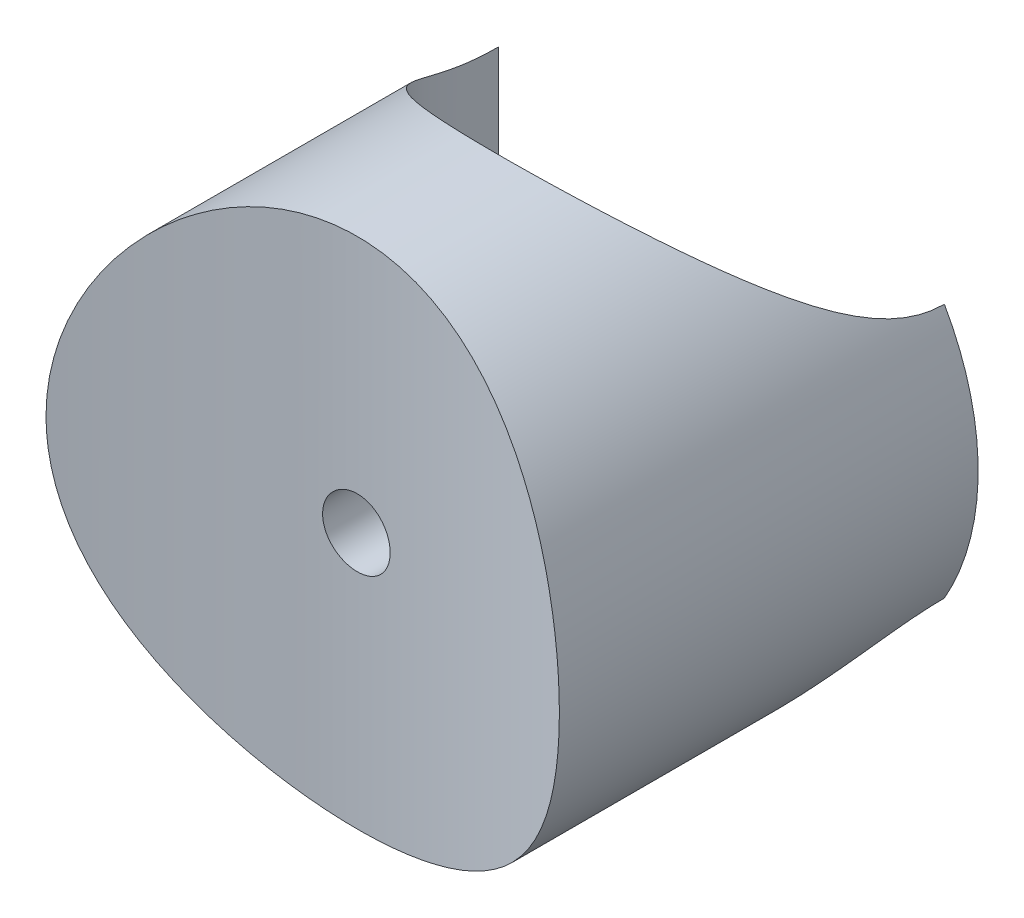
ISO-10303-21;
HEADER;
FILE_DESCRIPTION(('STEP AP214'),'2;1');
FILE_NAME('part.step','',(''),(''),'','','');
FILE_SCHEMA(('AUTOMOTIVE_DESIGN { 1 0 10303 214 1 1 1 1 }'));
ENDSEC;
DATA;
#1=APPLICATION_CONTEXT('core data for automotive mechanical design processes');
#2=APPLICATION_PROTOCOL_DEFINITION('international standard','automotive_design',2000,#1);
#3=PRODUCT_CONTEXT('',#1,'mechanical');
#4=PRODUCT('Part','Part','',(#3));
#5=PRODUCT_RELATED_PRODUCT_CATEGORY('part','',(#4));
#6=PRODUCT_DEFINITION_FORMATION('','',#4);
#7=PRODUCT_DEFINITION_CONTEXT('part definition',#1,'design');
#8=PRODUCT_DEFINITION('design','',#6,#7);
#9=PRODUCT_DEFINITION_SHAPE('','',#8);
#10=(LENGTH_UNIT() NAMED_UNIT(*) SI_UNIT(.MILLI.,.METRE.));
#11=(NAMED_UNIT(*) PLANE_ANGLE_UNIT() SI_UNIT($,.RADIAN.));
#12=(NAMED_UNIT(*) SI_UNIT($,.STERADIAN.) SOLID_ANGLE_UNIT());
#13=UNCERTAINTY_MEASURE_WITH_UNIT(LENGTH_MEASURE(1.E-05),#10,'distance_accuracy_value','');
#14=(GEOMETRIC_REPRESENTATION_CONTEXT(3) GLOBAL_UNCERTAINTY_ASSIGNED_CONTEXT((#13)) GLOBAL_UNIT_ASSIGNED_CONTEXT((#10,
#11,#12)) REPRESENTATION_CONTEXT('',''));
#15=CARTESIAN_POINT('',(0.,0.,0.));
#16=DIRECTION('',(0.,0.,1.));
#17=DIRECTION('',(1.,0.,0.));
#18=AXIS2_PLACEMENT_3D('',#15,#16,#17);
#19=CARTESIAN_POINT('',(0.,0.,-32.5));
#20=DIRECTION('',(0.,0.,-1.));
#21=DIRECTION('',(-1.,0.,0.));
#22=AXIS2_PLACEMENT_3D('',#19,#20,#21);
#23=PLANE('',#22);
#24=DIRECTION('',(0.,1.,0.));
#25=VECTOR('',#24,1.);
#26=CARTESIAN_POINT('',(-16.5,-29.,-32.5));
#27=LINE('',#26,#25);
#28=CARTESIAN_POINT('',(-16.5,-9.42072184070838,-32.5));
#29=VERTEX_POINT('',#28);
#30=CARTESIAN_POINT('',(-16.5,9.42072184070838,-32.5));
#31=VERTEX_POINT('',#30);
#32=EDGE_CURVE('E11',#29,#31,#27,.T.);
#33=ORIENTED_EDGE('',*,*,#32,.F.);
#34=CARTESIAN_POINT('',(0.,0.,-32.5));
#35=DIRECTION('',(0.,0.,-1.));
#36=DIRECTION('',(-1.,0.,0.));
#37=AXIS2_PLACEMENT_3D('',#34,#35,#36);
#38=CIRCLE('',#37,19.);
#39=EDGE_CURVE('E75',#29,#31,#38,.T.);
#40=ORIENTED_EDGE('',*,*,#39,.T.);
#41=EDGE_LOOP('',(#33,#40));
#42=FACE_BOUND('',#41,.T.);
#43=ADVANCED_FACE('F34',(#42),#23,.T.);
#44=CARTESIAN_POINT('',(0.,0.,7.5));
#45=DIRECTION('',(0.,0.,-1.));
#46=DIRECTION('',(-1.,0.,0.));
#47=AXIS2_PLACEMENT_3D('',#44,#45,#46);
#48=CYLINDRICAL_SURFACE('',#47,19.);
#49=CARTESIAN_POINT('',(-19.,0.,-1.5));
#50=CARTESIAN_POINT('',(-18.9999968061516,0.508120083715892,-1.50000323270041));
#51=CARTESIAN_POINT('',(-18.9795872283028,1.01643435150634,-1.50911520125547));
#52=CARTESIAN_POINT('',(-18.8981499715706,2.02938654145466,-1.5452673265156));
#53=CARTESIAN_POINT('',(-18.8370950010575,2.53402176297282,-1.57231952926819));
#54=CARTESIAN_POINT('',(-18.6748272104095,3.53686724593084,-1.64352665717294));
#55=CARTESIAN_POINT('',(-18.5735154799703,4.03505853819964,-1.68772370056211));
#56=CARTESIAN_POINT('',(-18.3318269917446,5.02008900554331,-1.79174567776081));
#57=CARTESIAN_POINT('',(-18.1914564882207,5.50692998456524,-1.8515681094705));
#58=CARTESIAN_POINT('',(-17.8736314690609,6.46426187337672,-1.98468829598572));
#59=CARTESIAN_POINT('',(-17.6963254232805,6.93480970381511,-2.05793196369992));
#60=CARTESIAN_POINT('',(-17.3058177205645,7.85876915120886,-2.21587534820411));
#61=CARTESIAN_POINT('',(-17.0926147141053,8.31218012312982,-2.30057549566967));
#62=CARTESIAN_POINT('',(-16.6320672864486,9.1991254827015,-2.47900516670347));
#63=CARTESIAN_POINT('',(-16.3847410753244,9.63267030875023,-2.57272986625381));
#64=CARTESIAN_POINT('',(-15.8574377288539,10.4780707518599,-2.766795666451));
#65=CARTESIAN_POINT('',(-15.5774487316254,10.8899184100219,-2.86713916500892));
#66=CARTESIAN_POINT('',(-14.9707124230222,11.7112001473138,-3.07737691595444));
#67=CARTESIAN_POINT('',(-14.6422627573597,12.1193202289337,-3.18749476934294));
#68=CARTESIAN_POINT('',(-13.9530367830546,12.9068429647211,-3.4092791722256));
#69=CARTESIAN_POINT('',(-13.5922592827574,13.2862445593286,-3.52094577868088));
#70=CARTESIAN_POINT('',(-12.8402116608356,14.0143869330369,-3.74297619391307));
#71=CARTESIAN_POINT('',(-12.448925182167,14.3631110485538,-3.85333926679546));
#72=CARTESIAN_POINT('',(-11.6383182740834,15.0274436027312,-4.06982785927334));
#73=CARTESIAN_POINT('',(-11.2190075755931,15.343063439473,-4.17595482954693));
#74=CARTESIAN_POINT('',(-10.3366416149315,15.9515759874676,-4.38554233486541));
#75=CARTESIAN_POINT('',(-9.87249439049697,16.2429888934162,-4.48871106435918));
#76=CARTESIAN_POINT('',(-8.91904977103573,16.7854513971077,-4.684649150198));
#77=CARTESIAN_POINT('',(-8.4297514873122,17.0364995672925,-4.77741813870584));
#78=CARTESIAN_POINT('',(-7.42945564798963,17.4958844966807,-4.94985986879758));
#79=CARTESIAN_POINT('',(-6.91846535055817,17.7042354085496,-5.02953694815561));
#80=CARTESIAN_POINT('',(-5.87835772829448,18.0762246093987,-5.17347430130703));
#81=CARTESIAN_POINT('',(-5.34924161041976,18.2398658690063,-5.23773559933099));
#82=CARTESIAN_POINT('',(-4.30380768991563,18.5136292420768,-5.34611814456463));
#83=CARTESIAN_POINT('',(-3.78817001783577,18.6260156650139,-5.39108480180873));
#84=CARTESIAN_POINT('',(-2.74815797344128,18.8076111482239,-5.46408286777999));
#85=CARTESIAN_POINT('',(-2.22378386761206,18.8768215230192,-5.49211479209509));
#86=CARTESIAN_POINT('',(-1.17061708995199,18.9712701352727,-5.53043310036688));
#87=CARTESIAN_POINT('',(-0.641825928484818,18.99652283112,-5.54072531918767));
#88=CARTESIAN_POINT('',(0.416053784523138,19.0028064648169,-5.54328289101318));
#89=CARTESIAN_POINT('',(0.945142324455586,18.9838390231902,-5.53554890461949));
#90=CARTESIAN_POINT('',(1.96860819966483,18.9042989557044,-5.50325313499592));
#91=CARTESIAN_POINT('',(2.46321299024332,18.846212955318,-5.47969731342743));
#92=CARTESIAN_POINT('',(3.44538453851226,18.6916143025905,-5.41740614118384));
#93=CARTESIAN_POINT('',(3.93295162060371,18.5951034273314,-5.37867149250374));
#94=CARTESIAN_POINT('',(4.89777544315104,18.3645808183833,-5.28699200594188));
#95=CARTESIAN_POINT('',(5.37503181665757,18.2305677523838,-5.23404666321082));
#96=CARTESIAN_POINT('',(6.31617504604602,17.9262529332713,-5.11524429595155));
#97=CARTESIAN_POINT('',(6.78006151557177,17.7559501326687,-5.04938689872612));
#98=CARTESIAN_POINT('',(7.69857141412963,17.3776412615544,-4.90525311138131));
#99=CARTESIAN_POINT('',(8.1529488194932,17.1691041695716,-4.82680403993184));
#100=CARTESIAN_POINT('',(9.04244511401233,16.717743241655,-4.66010624091761));
#101=CARTESIAN_POINT('',(9.47756395044071,16.4749193118565,-4.57185748652505));
#102=CARTESIAN_POINT('',(10.3262691367563,15.9566732341316,-4.38761779449744));
#103=CARTESIAN_POINT('',(10.7398529424516,15.6812472470577,-4.2916259454772));
#104=CARTESIAN_POINT('',(11.5434779203044,15.0994799325993,-4.09408903391974));
#105=CARTESIAN_POINT('',(11.9335105715045,14.7931275216837,-3.99254198650444));
#106=CARTESIAN_POINT('',(12.7134720308623,14.1296553024232,-3.77927454109198));
#107=CARTESIAN_POINT('',(13.1016134515575,13.7705039272711,-3.66733033655211));
#108=CARTESIAN_POINT('',(13.8465475456383,13.0212227597516,-3.44272555786823));
#109=CARTESIAN_POINT('',(14.2033384917362,12.631091262753,-3.33006494461919));
#110=CARTESIAN_POINT('',(14.8836591642212,11.8218547242359,-3.10698250769516));
#111=CARTESIAN_POINT('',(15.2071712826138,11.4027345387889,-2.99656189376656));
#112=CARTESIAN_POINT('',(15.8185605947678,10.538185257577,-2.78111650347285));
#113=CARTESIAN_POINT('',(16.1064508550258,10.0927658977352,-2.67608975689526));
#114=CARTESIAN_POINT('',(16.6529142189862,9.16403184108936,-2.47135686906816));
#115=CARTESIAN_POINT('',(16.9103278959267,8.67997627424323,-2.37191006798785));
#116=CARTESIAN_POINT('',(17.3831324926155,7.68946399042528,-2.18516461226563));
#117=CARTESIAN_POINT('',(17.5985221931179,7.1830066240306,-2.09786631011039));
#118=CARTESIAN_POINT('',(17.9850690397887,6.15146131018148,-1.9384903888239));
#119=CARTESIAN_POINT('',(18.1562507015374,5.62638387303613,-1.86640433780794));
#120=CARTESIAN_POINT('',(18.4526376023688,4.56131935999592,-1.74005266452856));
#121=CARTESIAN_POINT('',(18.5778467057353,4.021333541349,-1.68578554451205));
#122=CARTESIAN_POINT('',(18.7744048789056,2.96511816320691,-1.5999505651071));
#123=CARTESIAN_POINT('',(18.8486395597601,2.44952287232588,-1.56717246021173));
#124=CARTESIAN_POINT('',(18.9545331908383,1.41313553762849,-1.52027337321897));
#125=CARTESIAN_POINT('',(18.9861939369025,0.892343713944283,-1.50615160416627));
#126=CARTESIAN_POINT('',(19.0065563083807,-0.150097923547006,-1.49707894535153));
#127=CARTESIAN_POINT('',(18.9952699241801,-0.671747457241807,-1.5021227047757));
#128=CARTESIAN_POINT('',(18.9299016237795,-1.71181354655844,-1.531185933813));
#129=CARTESIAN_POINT('',(18.8758208674971,-2.23023018942212,-1.55520488911407));
#130=CARTESIAN_POINT('',(18.7300270810513,-3.22881433966429,-1.61936304577683));
#131=CARTESIAN_POINT('',(18.6407662993263,-3.7094107008876,-1.65844872724229));
#132=CARTESIAN_POINT('',(18.4258986127166,-4.66091499762507,-1.75140732207797));
#133=CARTESIAN_POINT('',(18.3002934699481,-5.13182340166383,-1.80527951853381));
#134=CARTESIAN_POINT('',(18.0138620601886,-6.06112563538481,-1.92622881120141));
#135=CARTESIAN_POINT('',(17.8530300445921,-6.51951740875501,-1.99330806246616));
#136=CARTESIAN_POINT('',(17.4974848009936,-7.42111027275482,-2.13878017160536));
#137=CARTESIAN_POINT('',(17.3027700337494,-7.8643106721679,-2.21717354343561));
#138=CARTESIAN_POINT('',(16.8721807343666,-8.75113810327113,-2.3866167015838));
#139=CARTESIAN_POINT('',(16.634938164071,-9.19402641297935,-2.47805554782868));
#140=CARTESIAN_POINT('',(16.1269622970097,-10.0584507829348,-2.66844042473936));
#141=CARTESIAN_POINT('',(15.8562283872592,-10.4799864521702,-2.7673865927972));
#142=CARTESIAN_POINT('',(15.2828739036238,-11.2997359645134,-2.97025952910865));
#143=CARTESIAN_POINT('',(14.9802421146621,-11.6979415278398,-3.07418804207213));
#144=CARTESIAN_POINT('',(14.3448859941635,-12.4689130751681,-3.28441956679426));
#145=CARTESIAN_POINT('',(14.0121604207057,-12.8416780081623,-3.39072267641215));
#146=CARTESIAN_POINT('',(13.2915128768573,-13.587678997941,-3.61137444383598));
#147=CARTESIAN_POINT('',(12.9013122062659,-13.9587217954202,-3.72570949316909));
#148=CARTESIAN_POINT('',(12.0904577763359,-14.6666416639303,-3.95101159928835));
#149=CARTESIAN_POINT('',(11.6698167325468,-15.0035328611826,-4.06198003519705));
#150=CARTESIAN_POINT('',(10.8002203449696,-15.6411638049624,-4.27763671425065));
#151=CARTESIAN_POINT('',(10.3512559815946,-15.9418919458248,-4.38232293589858));
#152=CARTESIAN_POINT('',(9.42782754586106,-16.5048005638121,-4.58252157127285));
#153=CARTESIAN_POINT('',(8.95336404810467,-16.7669819090604,-4.6780341915837));
#154=CARTESIAN_POINT('',(7.98147049570537,-17.2508278264758,-4.85732419847162));
#155=CARTESIAN_POINT('',(7.48401879821577,-17.4724532009918,-4.94109021378903));
#156=CARTESIAN_POINT('',(6.46998139395418,-17.8727852143391,-5.09438825428916));
#157=CARTESIAN_POINT('',(5.95339549997652,-18.0514914331287,-5.16392014016415));
#158=CARTESIAN_POINT('',(4.9051825449869,-18.3640448517749,-5.2866777423393));
#159=CARTESIAN_POINT('',(4.37356259856442,-18.497912897623,-5.33991103512735));
#160=CARTESIAN_POINT('',(3.2993148971874,-18.719380810321,-5.42850502538485));
#161=CARTESIAN_POINT('',(2.75668792282851,-18.8069839463528,-5.46386698567502));
#162=CARTESIAN_POINT('',(1.70174092070483,-18.9305805266143,-5.51389400857456));
#163=CARTESIAN_POINT('',(1.18983739051811,-18.9696490687704,-5.52979122573488));
#164=CARTESIAN_POINT('',(0.164313036444923,-19.0062153272419,-5.54466785355736));
#165=CARTESIAN_POINT('',(-0.349307704782255,-19.0037150165029,-5.54364806713623));
#166=CARTESIAN_POINT('',(-1.3742674348634,-18.9571765528583,-5.52472033552086));
#167=CARTESIAN_POINT('',(-1.88560674880505,-18.9131445210609,-5.50681487900307));
#168=CARTESIAN_POINT('',(-2.90222085143709,-18.7840265514538,-5.45460572036332));
#169=CARTESIAN_POINT('',(-3.4074956689089,-18.6989408085597,-5.42030209609685));
#170=CARTESIAN_POINT('',(-4.39187324672329,-18.492054379438,-5.3375967281589));
#171=CARTESIAN_POINT('',(-4.87129108331297,-18.3715480982333,-5.28969377316507));
#172=CARTESIAN_POINT('',(-5.81787655517018,-18.0940753736944,-5.18058767495316));
#173=CARTESIAN_POINT('',(-6.28504455548754,-17.9371100182322,-5.11938492857993));
#174=CARTESIAN_POINT('',(-7.20435762263021,-17.5880364121788,-4.98513495301438));
#175=CARTESIAN_POINT('',(-7.65650067936521,-17.3959234816082,-4.91208614663955));
#176=CARTESIAN_POINT('',(-8.54314851613133,-16.9780690991928,-4.75585280291758));
#177=CARTESIAN_POINT('',(-8.97765258748528,-16.7523262979072,-4.67266785886955));
#178=CARTESIAN_POINT('',(-9.84568966142393,-16.258009394124,-4.49415394172962));
#179=CARTESIAN_POINT('',(-10.2783123159727,-15.9879724910299,-4.39844848791847));
#180=CARTESIAN_POINT('',(-11.1194435348435,-15.414830641019,-4.20037359604074));
#181=CARTESIAN_POINT('',(-11.5279515187271,-15.1117248986372,-4.09800399769326));
#182=CARTESIAN_POINT('',(-12.318759049811,-14.4743257851833,-3.88905930128477));
#183=CARTESIAN_POINT('',(-12.7010566814681,-14.1400301388513,-3.7824838967438));
#184=CARTESIAN_POINT('',(-13.4376151044958,-13.4420262989736,-3.56765370101296));
#185=CARTESIAN_POINT('',(-13.7918626167476,-13.0783043375932,-3.45939814308878));
#186=CARTESIAN_POINT('',(-14.4921542185302,-12.299155340813,-3.23694486619885));
#187=CARTESIAN_POINT('',(-14.8361960554677,-11.8819065580877,-3.12281415480564));
#188=CARTESIAN_POINT('',(-15.487835391996,-11.0190348379258,-2.89899919085109));
#189=CARTESIAN_POINT('',(-15.7954486717224,-10.5734243158003,-2.78931302664471));
#190=CARTESIAN_POINT('',(-16.3724954931823,-9.65584577451361,-2.57749768411028));
#191=CARTESIAN_POINT('',(-16.6418959218868,-9.18385538379989,-2.47537509610788));
#192=CARTESIAN_POINT('',(-17.1400290166037,-8.21676378495376,-2.28200612721537));
#193=CARTESIAN_POINT('',(-17.3687647444292,-7.72166432034583,-2.19075892764307));
#194=CARTESIAN_POINT('',(-17.7818643518848,-6.71555469572371,-2.02284368511565));
#195=CARTESIAN_POINT('',(-17.9665643512006,-6.2047010463801,-1.94606620749909));
#196=CARTESIAN_POINT('',(-18.2920432161764,-5.16690294171791,-1.80887695426729));
#197=CARTESIAN_POINT('',(-18.4328141770547,-4.63995560913963,-1.74846812435482));
#198=CARTESIAN_POINT('',(-18.6684193999069,-3.57578960425236,-1.64642408244801));
#199=CARTESIAN_POINT('',(-18.7633902151937,-3.03860649151373,-1.60473308913316));
#200=CARTESIAN_POINT('',(-18.9067864971743,-1.95717041950469,-1.54149236831066));
#201=CARTESIAN_POINT('',(-18.9552486026065,-1.41292336824245,-1.51992678672995));
#202=CARTESIAN_POINT('',(-18.9867858607389,-0.72313756856455,-1.50588654240742));
#203=CARTESIAN_POINT('',(-18.9917399211727,-0.578568306035021,-1.50368034811336));
#204=CARTESIAN_POINT('',(-18.9983474535879,-0.28933794353149,-1.50073661308571));
#205=CARTESIAN_POINT('',(-19.0000009093833,-0.144676843110594,-1.49999907955441));
#206=CARTESIAN_POINT('',(-19.,0.,-1.5));
#207=B_SPLINE_CURVE_WITH_KNOTS('',3,(#49,#50,#51,#52,#53,#54,#55,#56,#57,#58,#59,#60,#61,#62,
#63,#64,#65,#66,#67,#68,#69,#70,#71,#72,#73,#74,#75,#76,#77,#78,#79,#80,#81,#82,#83,#84,#85,#86,
#87,#88,#89,#90,#91,#92,#93,#94,#95,#96,#97,#98,#99,#100,#101,#102,#103,#104,#105,#106,#107,
#108,#109,#110,#111,#112,#113,#114,#115,#116,#117,#118,#119,#120,#121,#122,#123,#124,#125,#126,
#127,#128,#129,#130,#131,#132,#133,#134,#135,#136,#137,#138,#139,#140,#141,#142,#143,#144,#145,
#146,#147,#148,#149,#150,#151,#152,#153,#154,#155,#156,#157,#158,#159,#160,#161,#162,#163,#164,
#165,#166,#167,#168,#169,#170,#171,#172,#173,#174,#175,#176,#177,#178,#179,#180,#181,#182,#183,
#184,#185,#186,#187,#188,#189,#190,#191,#192,#193,#194,#195,#196,#197,#198,#199,#200,#201,#202,
#203,#204,#205,#206),.UNSPECIFIED.,.T.,.F.,(4,2,2,2,2,2,2,2,2,2,2,2,2,2,2,2,2,2,2,2,2,2,2,2,2,2,
2,2,2,2,2,2,2,2,2,2,2,2,2,2,2,2,2,2,2,2,2,2,2,2,2,2,2,2,2,2,2,2,2,2,2,2,2,2,2,2,2,2,2,2,2,2,2,2,
2,2,2,2,4),(0.,1.52420878221819,3.04944203861253,4.57844617653031,6.10720562433383,
7.62993456291788,9.15272076032419,10.674697433666,12.1972285618957,13.8014133791777,
15.4056573535676,17.0107674188519,18.6153230044278,20.2862396065638,21.9572152901256,
23.6276362039255,25.2979461035471,26.884854870386,28.4717153204157,30.0580537277734,
31.6443340019201,33.1382581346464,34.6321131840708,36.1260213112364,37.6199725653443,
39.1365069335628,40.6530454535754,42.1697627358623,43.6870255279751,45.306798182787,
46.9266600248125,48.5473745824691,50.1674928702999,51.8369363862371,53.506428330707,
55.1749924602283,56.8434163042743,58.4071941071866,59.9709059452415,61.5341812434934,
63.0974141714975,64.5668665418411,66.0362476793429,67.5058687812091,68.9755566631809,
70.5059580640158,72.0363874796015,73.5673567900943,75.0983893100208,76.7478321974119,
78.3965900131789,80.0458755540072,81.69512394511,83.3459580238787,84.9968082583906,
86.6468899171349,88.2968549618126,89.8358376174629,91.3747472299565,92.913430067342,
94.4521055994174,95.9403629162886,97.4285758319984,98.916987051055,100.405458010579,
101.960417363132,103.515414128199,105.070524416937,106.626366557919,108.282542435249,
109.937998244919,111.594879925262,113.251636799267,114.895311087057,116.539280974408,
118.178318581873,119.816063922026,120.250049195407,120.684036597046),.UNSPECIFIED.);
#208=CARTESIAN_POINT('',(-19.,0.,-1.5));
#209=VERTEX_POINT('',#208);
#210=EDGE_CURVE('E69',#209,#209,#207,.T.);
#211=ORIENTED_EDGE('',*,*,#210,.T.);
#212=EDGE_LOOP('',(#211));
#213=FACE_BOUND('',#212,.T.);
#214=ORIENTED_EDGE('',*,*,#39,.F.);
#215=CARTESIAN_POINT('',(-16.5,-9.42072184070838,-32.5));
#216=CARTESIAN_POINT('',(-16.5000026593556,-9.42071112495172,-32.3634807124667));
#217=CARTESIAN_POINT('',(-16.4983051242486,-9.42369097355764,-32.2269851172795));
#218=CARTESIAN_POINT('',(-16.4915387259076,-9.4355296565146,-31.9543557672527));
#219=CARTESIAN_POINT('',(-16.4864704448669,-9.44438747562517,-31.8182219540023));
#220=CARTESIAN_POINT('',(-16.4662855434469,-9.4795681336582,-31.4114364604181));
#221=CARTESIAN_POINT('',(-16.4461885521915,-9.51449919706588,-31.1417219815974));
#222=CARTESIAN_POINT('',(-16.3937124602259,-9.60462483688658,-30.6116000142158));
#223=CARTESIAN_POINT('',(-16.3615392178767,-9.65947930714948,-30.3511124695823));
#224=CARTESIAN_POINT('',(-16.2856245757382,-9.78692643336626,-29.8361236381147));
#225=CARTESIAN_POINT('',(-16.2418758128903,-9.85953037731788,-29.5816262741696));
#226=CARTESIAN_POINT('',(-16.1217824376439,-10.0551707844022,-28.9680613323574));
#227=CARTESIAN_POINT('',(-16.0395888254641,-10.1862884532952,-28.6127177084618));
#228=CARTESIAN_POINT('',(-15.8548245084295,-10.4715526264715,-27.9169577270126));
#229=CARTESIAN_POINT('',(-15.7522442847731,-10.6257098798982,-27.5765484334924));
#230=CARTESIAN_POINT('',(-15.5272462012435,-10.9519053266985,-26.9071078573081));
#231=CARTESIAN_POINT('',(-15.404655940303,-11.1240937839436,-26.5782086690226));
#232=CARTESIAN_POINT('',(-15.1413923688458,-11.4798645573188,-25.9342402219766));
#233=CARTESIAN_POINT('',(-15.0007200008721,-11.663446279309,-25.6191702435062));
#234=CARTESIAN_POINT('',(-14.6182212674536,-12.1427733277883,-24.8290123455853));
#235=CARTESIAN_POINT('',(-14.363864675227,-12.4437571274214,-24.3631242815073));
#236=CARTESIAN_POINT('',(-13.8136709326864,-13.0518598970659,-23.4605406327489));
#237=CARTESIAN_POINT('',(-13.5178124456912,-13.3589819527484,-23.0238602357482));
#238=CARTESIAN_POINT('',(-12.8855588738018,-13.9697937967022,-22.1806355987712));
#239=CARTESIAN_POINT('',(-12.5492705046207,-14.2734904030041,-21.774016406893));
#240=CARTESIAN_POINT('',(-11.835317966303,-14.8708374352929,-20.9910595939283));
#241=CARTESIAN_POINT('',(-11.4576719079489,-15.1644921853276,-20.6147088423415));
#242=CARTESIAN_POINT('',(-10.7512639324318,-15.6701560785016,-19.9767250903143));
#243=CARTESIAN_POINT('',(-10.4308977930897,-15.8855532202438,-19.7084591567319));
#244=CARTESIAN_POINT('',(-9.76524456328717,-16.3032000007888,-19.1933448534511));
#245=CARTESIAN_POINT('',(-9.41995817464101,-16.5054500095417,-18.9464958810304));
#246=CARTESIAN_POINT('',(-8.70521982582802,-16.8933212645912,-18.476739938199));
#247=CARTESIAN_POINT('',(-8.33579437552578,-17.078960239445,-18.2538073905465));
#248=CARTESIAN_POINT('',(-7.57332015536153,-17.4304598496376,-17.8342560626532));
#249=CARTESIAN_POINT('',(-7.18027610793017,-17.5963244191185,-17.6376320473427));
#250=CARTESIAN_POINT('',(-6.44690676187933,-17.8762884953902,-17.3073085925283));
#251=CARTESIAN_POINT('',(-6.11027665089846,-17.9942882149241,-17.168697163416));
#252=CARTESIAN_POINT('',(-5.42366608340092,-18.2130061472256,-16.9125679817164));
#253=CARTESIAN_POINT('',(-5.07368834837903,-18.313727860085,-16.7950459567206));
#254=CARTESIAN_POINT('',(-4.36218568634605,-18.4961116022054,-16.5827422089463));
#255=CARTESIAN_POINT('',(-4.0006653574885,-18.5777811160841,-16.4879515557838));
#256=CARTESIAN_POINT('',(-3.26811623010285,-18.7205407527592,-16.3225344026562));
#257=CARTESIAN_POINT('',(-2.89708732606698,-18.7816306470962,-16.2519081709459));
#258=CARTESIAN_POINT('',(-2.146207873827,-18.8822137814922,-16.1357448239765));
#259=CARTESIAN_POINT('',(-1.76632162648315,-18.9215936963726,-16.0903393508973));
#260=CARTESIAN_POINT('',(-1.0026221937822,-18.9773898008174,-16.0260332622062));
#261=CARTESIAN_POINT('',(-0.618808999624902,-18.9938059389092,-16.0071327060042));
#262=CARTESIAN_POINT('',(0.149441214361076,-19.0032951858664,-15.9962054342642));
#263=CARTESIAN_POINT('',(0.533878151720864,-18.996371163454,-16.0041754160876));
#264=CARTESIAN_POINT('',(1.30012437937202,-18.9593455959141,-16.0468271072473));
#265=CARTESIAN_POINT('',(1.68193379925094,-18.929245202217,-16.0815074895782));
#266=CARTESIAN_POINT('',(2.40860091541762,-18.8499620219524,-16.1729813162804));
#267=CARTESIAN_POINT('',(2.75391518587713,-18.8025521520015,-16.2277216255692));
#268=CARTESIAN_POINT('',(3.43749260123229,-18.6896666355649,-16.358292664329));
#269=CARTESIAN_POINT('',(3.77575621762205,-18.6241922012955,-16.4341219786322));
#270=CARTESIAN_POINT('',(4.44337399608329,-18.4762916034199,-16.6058107726031));
#271=CARTESIAN_POINT('',(4.77272752067094,-18.3938642305044,-16.7016716811985));
#272=CARTESIAN_POINT('',(5.42095550323889,-18.2133594611522,-16.9122035753604));
#273=CARTESIAN_POINT('',(5.73982931098593,-18.1152810958234,-17.02687572547));
#274=CARTESIAN_POINT('',(6.38814226883366,-17.8973952462578,-17.2825250809611));
#275=CARTESIAN_POINT('',(6.71671846517023,-17.7765381422414,-17.4247935086256));
#276=CARTESIAN_POINT('',(7.35930213217976,-17.5202838697215,-17.7278340082851));
#277=CARTESIAN_POINT('',(7.67330931600861,-17.3848864151119,-17.8886064443822));
#278=CARTESIAN_POINT('',(8.28612462892235,-17.1012915144064,-18.2272029282607));
#279=CARTESIAN_POINT('',(8.58492690592603,-16.9530891982895,-18.4050334665398));
#280=CARTESIAN_POINT('',(9.16677510780081,-16.6456767855334,-18.7763203472914));
#281=CARTESIAN_POINT('',(9.44981777498679,-16.4864644281342,-18.9697799003464));
#282=CARTESIAN_POINT('',(10.1408129600094,-16.0747705945973,-19.4739098536902));
#283=CARTESIAN_POINT('',(10.538478450599,-15.8162900577519,-19.7938568850849));
#284=CARTESIAN_POINT('',(11.2969939090014,-15.2837444591897,-20.4632219654285));
#285=CARTESIAN_POINT('',(11.6578267079245,-15.0096722215437,-20.8126536207298));
#286=CARTESIAN_POINT('',(12.3436234205276,-14.4509861664898,-21.5393797312936));
#287=CARTESIAN_POINT('',(12.6684973696469,-14.1663481869101,-21.9167402972903));
#288=CARTESIAN_POINT('',(13.2815914629734,-13.5932067399417,-22.6971642066583));
#289=CARTESIAN_POINT('',(13.5698218254656,-13.3047043750743,-23.1002203373869));
#290=CARTESIAN_POINT('',(14.0644008635408,-12.7788940381234,-23.8621329136006));
#291=CARTESIAN_POINT('',(14.2763705046297,-12.5411285393745,-24.2170381713177));
#292=CARTESIAN_POINT('',(14.674828560404,-12.0724464291267,-24.9454092161592));
#293=CARTESIAN_POINT('',(14.8613111074816,-11.8415314042832,-25.3188792503471));
#294=CARTESIAN_POINT('',(15.2075643421666,-11.3934149043931,-26.0846973070567));
#295=CARTESIAN_POINT('',(15.3673967639313,-11.1761824820648,-26.4769989108956));
#296=CARTESIAN_POINT('',(15.6592198351225,-10.7634862137888,-27.2824912168395));
#297=CARTESIAN_POINT('',(15.791232565848,-10.5680051617613,-27.6956650266507));
#298=CARTESIAN_POINT('',(16.0437261066847,-10.1813697447923,-28.612950457901));
#299=CARTESIAN_POINT('',(16.1590056057211,-9.99588296513461,-29.1210527226775));
#300=CARTESIAN_POINT('',(16.2965027532688,-9.76892523431365,-29.9031169549902));
#301=CARTESIAN_POINT('',(16.3363932262939,-9.70188932921278,-30.1666548035007));
#302=CARTESIAN_POINT('',(16.4036660591361,-9.58770678120119,-30.6995191087282));
#303=CARTESIAN_POINT('',(16.4310565213797,-9.54054725606924,-30.9688416969162));
#304=CARTESIAN_POINT('',(16.4677672367278,-9.47700934377163,-31.4482479984963));
#305=CARTESIAN_POINT('',(16.4798103232761,-9.4560200652206,-31.6575196595703));
#306=CARTESIAN_POINT('',(16.4959486477701,-9.42781744830826,-32.0778374641828));
#307=CARTESIAN_POINT('',(16.5000230333553,-9.42064025395676,-32.2888868157899));
#308=CARTESIAN_POINT('',(16.5,-9.42072184070839,-32.5));
#309=B_SPLINE_CURVE_WITH_KNOTS('',3,(#215,#216,#217,#218,#219,#220,#221,#222,#223,#224,#225,
#226,#227,#228,#229,#230,#231,#232,#233,#234,#235,#236,#237,#238,#239,#240,#241,#242,#243,#244,
#245,#246,#247,#248,#249,#250,#251,#252,#253,#254,#255,#256,#257,#258,#259,#260,#261,#262,#263,
#264,#265,#266,#267,#268,#269,#270,#271,#272,#273,#274,#275,#276,#277,#278,#279,#280,#281,#282,
#283,#284,#285,#286,#287,#288,#289,#290,#291,#292,#293,#294,#295,#296,#297,#298,#299,#300,#301,
#302,#303,#304,#305,#306,#307,#308),.UNSPECIFIED.,.F.,.F.,(4,2,2,2,2,2,2,2,2,2,2,2,2,2,2,2,2,2,
2,2,2,2,2,2,2,2,2,2,2,2,2,2,2,2,2,2,2,2,2,2,2,2,2,2,2,2,4),(0.,0.409469323042043,
0.818867941125833,1.63563799693357,2.4390744733162,3.24302324038348,4.40380959948232,
5.5651392251535,6.73706107377593,7.90892185987655,9.7370487294004,11.5661189317845,
13.3904630915434,15.2140115304834,16.62312756,18.0322039208952,19.4397580095464,
20.8470315946188,21.9940169003177,23.1407695804021,24.2870709995196,25.4333851435864,
26.58562767133,27.7378727817865,28.8899762757879,30.0420225355713,31.0993245543548,
32.156555640498,33.2138621686033,34.2712341758527,35.4038514380383,36.5364909904683,
37.669563227429,38.8028688199448,40.5167217685799,42.2313699851376,43.9502154402598,
45.6685805286931,47.0982437325272,48.5282355192519,49.9548673158196,51.3803624522866,
53.0333179275006,53.85697666116,54.6801007435667,55.3115182325565,55.9445858049819),.UNSPECIFIED.);
#310=CARTESIAN_POINT('',(16.5,-9.42072184070838,-32.5));
#311=VERTEX_POINT('',#310);
#312=EDGE_CURVE('E60',#29,#311,#309,.T.);
#313=ORIENTED_EDGE('',*,*,#312,.T.);
#314=CARTESIAN_POINT('',(16.5,9.42072184070838,-32.5));
#315=VERTEX_POINT('',#314);
#316=EDGE_CURVE('E73',#315,#311,#38,.T.);
#317=ORIENTED_EDGE('',*,*,#316,.F.);
#318=CARTESIAN_POINT('',(16.5,9.42072184070838,-32.5));
#319=CARTESIAN_POINT('',(16.5000026593556,9.42071112495172,-32.3634807124667));
#320=CARTESIAN_POINT('',(16.4983051242486,9.42369097355764,-32.2269851172795));
#321=CARTESIAN_POINT('',(16.4915387259076,9.4355296565146,-31.9543557672527));
#322=CARTESIAN_POINT('',(16.4864704448669,9.44438747562517,-31.8182219540023));
#323=CARTESIAN_POINT('',(16.4662855434469,9.4795681336582,-31.4114364604181));
#324=CARTESIAN_POINT('',(16.4461885521915,9.51449919706588,-31.1417219815974));
#325=CARTESIAN_POINT('',(16.3937124602259,9.60462483688658,-30.6116000142158));
#326=CARTESIAN_POINT('',(16.3615392178767,9.65947930714948,-30.3511124695823));
#327=CARTESIAN_POINT('',(16.2856245757382,9.78692643336626,-29.8361236381147));
#328=CARTESIAN_POINT('',(16.2418758128903,9.85953037731788,-29.5816262741696));
#329=CARTESIAN_POINT('',(16.1217824376439,10.0551707844022,-28.9680613323574));
#330=CARTESIAN_POINT('',(16.0395888254641,10.1862884532952,-28.6127177084618));
#331=CARTESIAN_POINT('',(15.8548245084295,10.4715526264715,-27.9169577270126));
#332=CARTESIAN_POINT('',(15.7522442847731,10.6257098798982,-27.5765484334924));
#333=CARTESIAN_POINT('',(15.5272462012435,10.9519053266985,-26.9071078573081));
#334=CARTESIAN_POINT('',(15.404655940303,11.1240937839436,-26.5782086690226));
#335=CARTESIAN_POINT('',(15.1413923688458,11.4798645573188,-25.9342402219766));
#336=CARTESIAN_POINT('',(15.0007200008721,11.663446279309,-25.6191702435062));
#337=CARTESIAN_POINT('',(14.6182212674536,12.1427733277883,-24.8290123455853));
#338=CARTESIAN_POINT('',(14.363864675227,12.4437571274214,-24.3631242815073));
#339=CARTESIAN_POINT('',(13.8136709326864,13.0518598970659,-23.4605406327489));
#340=CARTESIAN_POINT('',(13.5178124456912,13.3589819527484,-23.0238602357482));
#341=CARTESIAN_POINT('',(12.8855588738018,13.9697937967022,-22.1806355987712));
#342=CARTESIAN_POINT('',(12.5492705046207,14.2734904030041,-21.774016406893));
#343=CARTESIAN_POINT('',(11.835317966303,14.8708374352929,-20.9910595939283));
#344=CARTESIAN_POINT('',(11.4576719079489,15.1644921853276,-20.6147088423415));
#345=CARTESIAN_POINT('',(10.7512639324318,15.6701560785016,-19.9767250903143));
#346=CARTESIAN_POINT('',(10.4308977930897,15.8855532202438,-19.7084591567319));
#347=CARTESIAN_POINT('',(9.76524456328717,16.3032000007888,-19.1933448534511));
#348=CARTESIAN_POINT('',(9.41995817464101,16.5054500095417,-18.9464958810304));
#349=CARTESIAN_POINT('',(8.70521982582802,16.8933212645912,-18.476739938199));
#350=CARTESIAN_POINT('',(8.33579437552578,17.078960239445,-18.2538073905465));
#351=CARTESIAN_POINT('',(7.57332015536153,17.4304598496376,-17.8342560626532));
#352=CARTESIAN_POINT('',(7.18027610793017,17.5963244191185,-17.6376320473427));
#353=CARTESIAN_POINT('',(6.44690676187933,17.8762884953902,-17.3073085925283));
#354=CARTESIAN_POINT('',(6.11027665089846,17.9942882149241,-17.168697163416));
#355=CARTESIAN_POINT('',(5.42366608340092,18.2130061472256,-16.9125679817164));
#356=CARTESIAN_POINT('',(5.07368834837903,18.313727860085,-16.7950459567206));
#357=CARTESIAN_POINT('',(4.36218568634605,18.4961116022054,-16.5827422089463));
#358=CARTESIAN_POINT('',(4.0006653574885,18.5777811160841,-16.4879515557838));
#359=CARTESIAN_POINT('',(3.26811623010285,18.7205407527592,-16.3225344026562));
#360=CARTESIAN_POINT('',(2.89708732606698,18.7816306470962,-16.2519081709459));
#361=CARTESIAN_POINT('',(2.146207873827,18.8822137814922,-16.1357448239765));
#362=CARTESIAN_POINT('',(1.76632162648315,18.9215936963726,-16.0903393508973));
#363=CARTESIAN_POINT('',(1.0026221937822,18.9773898008174,-16.0260332622062));
#364=CARTESIAN_POINT('',(0.618808999624902,18.9938059389092,-16.0071327060042));
#365=CARTESIAN_POINT('',(-0.149441214361076,19.0032951858664,-15.9962054342642));
#366=CARTESIAN_POINT('',(-0.533878151720864,18.996371163454,-16.0041754160876));
#367=CARTESIAN_POINT('',(-1.30012437937202,18.9593455959141,-16.0468271072473));
#368=CARTESIAN_POINT('',(-1.68193379925094,18.929245202217,-16.0815074895782));
#369=CARTESIAN_POINT('',(-2.40860091541762,18.8499620219524,-16.1729813162804));
#370=CARTESIAN_POINT('',(-2.75391518587713,18.8025521520015,-16.2277216255692));
#371=CARTESIAN_POINT('',(-3.43749260123229,18.6896666355649,-16.358292664329));
#372=CARTESIAN_POINT('',(-3.77575621762205,18.6241922012955,-16.4341219786322));
#373=CARTESIAN_POINT('',(-4.44337399608329,18.4762916034199,-16.6058107726031));
#374=CARTESIAN_POINT('',(-4.77272752067094,18.3938642305044,-16.7016716811985));
#375=CARTESIAN_POINT('',(-5.42095550323889,18.2133594611522,-16.9122035753604));
#376=CARTESIAN_POINT('',(-5.73982931098593,18.1152810958234,-17.02687572547));
#377=CARTESIAN_POINT('',(-6.38814226883366,17.8973952462578,-17.2825250809611));
#378=CARTESIAN_POINT('',(-6.71671846517023,17.7765381422414,-17.4247935086256));
#379=CARTESIAN_POINT('',(-7.35930213217976,17.5202838697215,-17.7278340082851));
#380=CARTESIAN_POINT('',(-7.67330931600861,17.3848864151119,-17.8886064443822));
#381=CARTESIAN_POINT('',(-8.28612462892235,17.1012915144064,-18.2272029282607));
#382=CARTESIAN_POINT('',(-8.58492690592603,16.9530891982895,-18.4050334665398));
#383=CARTESIAN_POINT('',(-9.16677510780081,16.6456767855334,-18.7763203472914));
#384=CARTESIAN_POINT('',(-9.44981777498679,16.4864644281342,-18.9697799003464));
#385=CARTESIAN_POINT('',(-10.1408129600094,16.0747705945973,-19.4739098536902));
#386=CARTESIAN_POINT('',(-10.538478450599,15.8162900577519,-19.7938568850849));
#387=CARTESIAN_POINT('',(-11.2969939090014,15.2837444591897,-20.4632219654285));
#388=CARTESIAN_POINT('',(-11.6578267079245,15.0096722215437,-20.8126536207298));
#389=CARTESIAN_POINT('',(-12.3436234205276,14.4509861664898,-21.5393797312936));
#390=CARTESIAN_POINT('',(-12.6684973696469,14.1663481869101,-21.9167402972903));
#391=CARTESIAN_POINT('',(-13.2815914629734,13.5932067399417,-22.6971642066583));
#392=CARTESIAN_POINT('',(-13.5698218254656,13.3047043750743,-23.1002203373869));
#393=CARTESIAN_POINT('',(-14.0644008635408,12.7788940381234,-23.8621329136006));
#394=CARTESIAN_POINT('',(-14.2763705046297,12.5411285393745,-24.2170381713177));
#395=CARTESIAN_POINT('',(-14.674828560404,12.0724464291267,-24.9454092161592));
#396=CARTESIAN_POINT('',(-14.8613111074816,11.8415314042832,-25.3188792503471));
#397=CARTESIAN_POINT('',(-15.2075643421666,11.3934149043931,-26.0846973070567));
#398=CARTESIAN_POINT('',(-15.3673967639313,11.1761824820648,-26.4769989108956));
#399=CARTESIAN_POINT('',(-15.6592198351225,10.7634862137888,-27.2824912168395));
#400=CARTESIAN_POINT('',(-15.791232565848,10.5680051617613,-27.6956650266507));
#401=CARTESIAN_POINT('',(-16.0437261066847,10.1813697447923,-28.612950457901));
#402=CARTESIAN_POINT('',(-16.1590056057211,9.99588296513461,-29.1210527226775));
#403=CARTESIAN_POINT('',(-16.2965027532688,9.76892523431365,-29.9031169549902));
#404=CARTESIAN_POINT('',(-16.3363932262939,9.70188932921278,-30.1666548035007));
#405=CARTESIAN_POINT('',(-16.4036660591361,9.58770678120119,-30.6995191087282));
#406=CARTESIAN_POINT('',(-16.4310565213797,9.54054725606924,-30.9688416969162));
#407=CARTESIAN_POINT('',(-16.4677672367278,9.47700934377163,-31.4482479984963));
#408=CARTESIAN_POINT('',(-16.4798103232761,9.4560200652206,-31.6575196595703));
#409=CARTESIAN_POINT('',(-16.4959486477701,9.42781744830826,-32.0778374641828));
#410=CARTESIAN_POINT('',(-16.5000230333553,9.42064025395676,-32.2888868157899));
#411=CARTESIAN_POINT('',(-16.5,9.42072184070839,-32.5));
#412=B_SPLINE_CURVE_WITH_KNOTS('',3,(#318,#319,#320,#321,#322,#323,#324,#325,#326,#327,#328,
#329,#330,#331,#332,#333,#334,#335,#336,#337,#338,#339,#340,#341,#342,#343,#344,#345,#346,#347,
#348,#349,#350,#351,#352,#353,#354,#355,#356,#357,#358,#359,#360,#361,#362,#363,#364,#365,#366,
#367,#368,#369,#370,#371,#372,#373,#374,#375,#376,#377,#378,#379,#380,#381,#382,#383,#384,#385,
#386,#387,#388,#389,#390,#391,#392,#393,#394,#395,#396,#397,#398,#399,#400,#401,#402,#403,#404,
#405,#406,#407,#408,#409,#410,#411),.UNSPECIFIED.,.F.,.F.,(4,2,2,2,2,2,2,2,2,2,2,2,2,2,2,2,2,2,
2,2,2,2,2,2,2,2,2,2,2,2,2,2,2,2,2,2,2,2,2,2,2,2,2,2,2,2,4),(0.,0.409469323042043,
0.818867941125833,1.63563799693357,2.4390744733162,3.24302324038348,4.40380959948232,
5.5651392251535,6.73706107377593,7.90892185987655,9.7370487294004,11.5661189317845,
13.3904630915434,15.2140115304834,16.62312756,18.0322039208952,19.4397580095464,
20.8470315946188,21.9940169003177,23.1407695804021,24.2870709995196,25.4333851435864,
26.58562767133,27.7378727817865,28.8899762757879,30.0420225355713,31.0993245543548,
32.156555640498,33.2138621686033,34.2712341758527,35.4038514380383,36.5364909904683,
37.669563227429,38.8028688199448,40.5167217685799,42.2313699851376,43.9502154402598,
45.6685805286931,47.0982437325272,48.5282355192519,49.9548673158196,51.3803624522866,
53.0333179275006,53.85697666116,54.6801007435667,55.3115182325565,55.9445858049819),.UNSPECIFIED.);
#413=EDGE_CURVE('E55',#315,#31,#412,.T.);
#414=ORIENTED_EDGE('',*,*,#413,.T.);
#415=EDGE_LOOP('',(#214,#313,#317,#414));
#416=FACE_BOUND('',#415,.T.);
#417=ADVANCED_FACE('F36',(#213,#416),#48,.T.);
#418=CARTESIAN_POINT('',(0.,69.7428311728166,41.1334870757452));
#419=DIRECTION('',(0.,-1.,0.));
#420=DIRECTION('',(0.,0.,-1.));
#421=AXIS2_PLACEMENT_3D('',#418,#419,#420);
#422=CYLINDRICAL_SURFACE('',#421,46.6756276898098);
#423=CARTESIAN_POINT('',(2.49999999999999,0.,-5.47514109799247));
#424=CARTESIAN_POINT('',(2.49999381195254,-0.140317995829727,-5.47514199705256));
#425=CARTESIAN_POINT('',(2.48814683283055,-0.280735171395804,-5.47578156290091));
#426=CARTESIAN_POINT('',(2.44105543736567,-0.557694942626729,-5.47827113078158));
#427=CARTESIAN_POINT('',(2.40578354067648,-0.694232790948638,-5.48012255443726));
#428=CARTESIAN_POINT('',(2.31285594922383,-0.959381849282382,-5.48482552207114));
#429=CARTESIAN_POINT('',(2.255211771259,-1.08799709828027,-5.48767655139968));
#430=CARTESIAN_POINT('',(2.11919385820187,-1.33369144247183,-5.49405682891946));
#431=CARTESIAN_POINT('',(2.0408249778015,-1.45077323053595,-5.49758591822456));
#432=CARTESIAN_POINT('',(1.8654832030246,-1.67024525930544,-5.50492924650828));
#433=CARTESIAN_POINT('',(1.76849176149686,-1.77262067398079,-5.5087437674317));
#434=CARTESIAN_POINT('',(1.55869555969224,-1.95964734021418,-5.516225492594));
#435=CARTESIAN_POINT('',(1.44589015058001,-2.04429786417758,-5.5198926907804));
#436=CARTESIAN_POINT('',(1.20758877024945,-2.19351402676558,-5.52666878117025));
#437=CARTESIAN_POINT('',(1.08208542982564,-2.25806791274806,-5.529777346234));
#438=CARTESIAN_POINT('',(0.822002593038721,-2.36518297825816,-5.53508299488738));
#439=CARTESIAN_POINT('',(0.687423172831254,-2.40774434229486,-5.53728008612391));
#440=CARTESIAN_POINT('',(0.413146635742595,-2.46962647763092,-5.54051330232142));
#441=CARTESIAN_POINT('',(0.273454604182421,-2.48896972870557,-5.54155055017597));
#442=CARTESIAN_POINT('',(-0.00719727821401524,-2.50393594198088,-5.54235096636067));
#443=CARTESIAN_POINT('',(-0.148157117930368,-2.49955911202754,-5.54211414585476));
#444=CARTESIAN_POINT('',(-0.427191056454761,-2.46722802841321,-5.54039405492782));
#445=CARTESIAN_POINT('',(-0.56526796728029,-2.43929796645668,-5.53891206343715));
#446=CARTESIAN_POINT('',(-0.834770675901485,-2.36069076244673,-5.53487001058733));
#447=CARTESIAN_POINT('',(-0.966196442789433,-2.31001351469844,-5.5323099442189));
#448=CARTESIAN_POINT('',(-1.21874400519127,-2.18732294638263,-5.52639787990401));
#449=CARTESIAN_POINT('',(-1.33986044351472,-2.11529861899087,-5.52304547359812));
#450=CARTESIAN_POINT('',(-1.56829275849716,-1.95196642691328,-5.5159261978578));
#451=CARTESIAN_POINT('',(-1.67560852250853,-1.86065840484089,-5.51215932504076));
#452=CARTESIAN_POINT('',(-1.87353430662024,-1.66121399616966,-5.50462966692449));
#453=CARTESIAN_POINT('',(-1.96412317667481,-1.55305661881284,-5.50086689270023));
#454=CARTESIAN_POINT('',(-2.12586072001349,-1.32305737837683,-5.49377438624971));
#455=CARTESIAN_POINT('',(-2.19700938753471,-1.201215511241,-5.49044465415183));
#456=CARTESIAN_POINT('',(-2.31784511941492,-0.947292990275312,-5.48459409483866));
#457=CARTESIAN_POINT('',(-2.36753136341575,-0.815211945300948,-5.48207329854428));
#458=CARTESIAN_POINT('',(-2.44401758731882,-0.544566233186848,-5.47812604393429));
#459=CARTESIAN_POINT('',(-2.47081776475463,-0.406001622018773,-5.47669957617338));
#460=CARTESIAN_POINT('',(-2.50074488823256,-0.126506422663905,-5.47510359604126));
#461=CARTESIAN_POINT('',(-2.50390120127977,0.0144210125236867,-5.47493252440308));
#462=CARTESIAN_POINT('',(-2.48652766081719,0.294803456673611,-5.47586255699002));
#463=CARTESIAN_POINT('',(-2.46599789739891,0.434258471234352,-5.47696365637635));
#464=CARTESIAN_POINT('',(-2.40185933512528,0.707654822383556,-5.48031250785245));
#465=CARTESIAN_POINT('',(-2.35826399982313,0.841599326393945,-5.48255959099502));
#466=CARTESIAN_POINT('',(-2.24924543362368,1.1002700875222,-5.48794658488498));
#467=CARTESIAN_POINT('',(-2.18382205755134,1.22499628332374,-5.49108650157044));
#468=CARTESIAN_POINT('',(-2.03292925347283,1.46182496122511,-5.49790907164238));
#469=CARTESIAN_POINT('',(-1.94744011173583,1.57391486737743,-5.50159225743595));
#470=CARTESIAN_POINT('',(-1.75887127141915,1.78216259464567,-5.50908438105324));
#471=CARTESIAN_POINT('',(-1.65579144473511,1.87832029972509,-5.51289331979258));
#472=CARTESIAN_POINT('',(-1.43484109054287,2.05207288057259,-5.52021222561744));
#473=CARTESIAN_POINT('',(-1.31695562723213,2.12964877813572,-5.52372188470347));
#474=CARTESIAN_POINT('',(-1.06981572552414,2.26390587722754,-5.53004229922384));
#475=CARTESIAN_POINT('',(-0.940561342056462,2.32058717970279,-5.5328530580347));
#476=CARTESIAN_POINT('',(-0.67442303882525,2.41141297407667,-5.53745744361514));
#477=CARTESIAN_POINT('',(-0.537543260633767,2.44556957283886,-5.53925161671896));
#478=CARTESIAN_POINT('',(-0.259981803432015,2.49041601994718,-5.54162281291249));
#479=CARTESIAN_POINT('',(-0.119300150060703,2.50110602650657,-5.54219984420824));
#480=CARTESIAN_POINT('',(0.161683406282259,2.49871433926745,-5.54207176266895));
#481=CARTESIAN_POINT('',(0.301985564187904,2.48566239567843,-5.5413682544326));
#482=CARTESIAN_POINT('',(0.578403535510163,2.43621885371523,-5.53876143766143));
#483=CARTESIAN_POINT('',(0.714519341163087,2.39982721205974,-5.5368581269017));
#484=CARTESIAN_POINT('',(0.978706478651226,2.3047435784712,-5.53206578486206));
#485=CARTESIAN_POINT('',(1.10677777735692,2.24605149470575,-5.52917674952299));
#486=CARTESIAN_POINT('',(1.35125112847242,2.10803783581179,-5.52273772748556));
#487=CARTESIAN_POINT('',(1.46765352434297,2.02871686811794,-5.51918776024977));
#488=CARTESIAN_POINT('',(1.68563424498253,1.85158934037299,-5.51182122435219));
#489=CARTESIAN_POINT('',(1.78719548945531,1.75376177395175,-5.50800435587161));
#490=CARTESIAN_POINT('',(1.97248616406475,1.54241690200772,-5.50053636567226));
#491=CARTESIAN_POINT('',(2.05621120698291,1.42889574758741,-5.49688528490611));
#492=CARTESIAN_POINT('',(2.20349802935826,1.18928630500591,-5.49015794739402));
#493=CARTESIAN_POINT('',(2.26703889249086,1.06318515714465,-5.48708228828955));
#494=CARTESIAN_POINT('',(2.37197035840639,0.802181629314139,-5.48186192981218));
#495=CARTESIAN_POINT('',(2.41338706694805,0.667289833926258,-5.47971613379927));
#496=CARTESIAN_POINT('',(2.46205676550425,0.442969388287114,-5.47716437329811));
#497=CARTESIAN_POINT('',(2.47626725139766,0.354992957433622,-5.47640900281251));
#498=CARTESIAN_POINT('',(2.49524082711916,0.178024326753136,-5.47539708017948));
#499=CARTESIAN_POINT('',(2.50000392633196,0.0890321279352583,-5.47514052753654));
#500=CARTESIAN_POINT('',(2.49999999999999,0.,-5.47514109799247));
#501=B_SPLINE_CURVE_WITH_KNOTS('',3,(#423,#424,#425,#426,#427,#428,#429,#430,#431,#432,#433,
#434,#435,#436,#437,#438,#439,#440,#441,#442,#443,#444,#445,#446,#447,#448,#449,#450,#451,#452,
#453,#454,#455,#456,#457,#458,#459,#460,#461,#462,#463,#464,#465,#466,#467,#468,#469,#470,#471,
#472,#473,#474,#475,#476,#477,#478,#479,#480,#481,#482,#483,#484,#485,#486,#487,#488,#489,#490,
#491,#492,#493,#494,#495,#496,#497,#498,#499,#500),.UNSPECIFIED.,.T.,.F.,(4,2,2,2,2,2,2,2,2,2,2,
2,2,2,2,2,2,2,2,2,2,2,2,2,2,2,2,2,2,2,2,2,2,2,2,2,2,2,4),(0.,0.420628980434554,
0.841752284764661,1.26265909024813,1.68346738692757,2.10469698249082,2.52594386585227,
2.94743663631305,3.36892587054896,3.79000668891747,4.21108381759263,4.63172898075482,
5.05237609846641,5.47324048559069,5.89410830779105,6.31550469874422,6.73690121461683,
7.15831383610248,7.57972282026681,8.00060830392554,8.42149218672481,8.84213066693561,
9.26277194480563,9.68382822689081,10.1048875754542,10.5263751492915,10.9478606867995,
11.3691194938639,11.790375460766,12.2111039300897,12.6318331796175,13.0525641617119,
13.4732827564347,13.8944817950421,14.3157843177921,14.7375220114793,15.1587609634332,
15.4256513945498,15.6925415605465),.UNSPECIFIED.);
#502=CARTESIAN_POINT('',(2.49999999999999,0.,-5.47514109799247));
#503=VERTEX_POINT('',#502);
#504=EDGE_CURVE('E96',#503,#503,#501,.T.);
#505=ORIENTED_EDGE('',*,*,#504,.T.);
#506=EDGE_LOOP('',(#505));
#507=FACE_BOUND('',#506,.T.);
#508=ORIENTED_EDGE('',*,*,#210,.F.);
#509=EDGE_LOOP('',(#508));
#510=FACE_BOUND('',#509,.T.);
#511=ADVANCED_FACE('F89',(#507,#510),#422,.F.);
#512=DIRECTION('',(0.,1.,0.));
#513=VECTOR('',#512,1.);
#514=CARTESIAN_POINT('',(16.5,-29.,-32.5));
#515=LINE('',#514,#513);
#516=EDGE_CURVE('E49',#315,#311,#515,.F.);
#517=ORIENTED_EDGE('',*,*,#516,.F.);
#518=ORIENTED_EDGE('',*,*,#316,.T.);
#519=EDGE_LOOP('',(#517,#518));
#520=FACE_BOUND('',#519,.T.);
#521=ADVANCED_FACE('F77',(#520),#23,.T.);
#522=CARTESIAN_POINT('',(0.,-29.,-32.5));
#523=DIRECTION('',(0.,1.,0.));
#524=DIRECTION('',(0.,0.,1.));
#525=AXIS2_PLACEMENT_3D('',#522,#523,#524);
#526=CYLINDRICAL_SURFACE('',#525,16.5);
#527=CARTESIAN_POINT('',(2.49999999999999,0.,-16.1904935696999));
#528=CARTESIAN_POINT('',(2.49999424838556,0.13955863160268,-16.190491218708));
#529=CARTESIAN_POINT('',(2.48827451128467,0.279197858987162,-16.1886829030964));
#530=CARTESIAN_POINT('',(2.44171835219536,0.554570946736798,-16.1816500694232));
#531=CARTESIAN_POINT('',(2.4068594890323,0.69030088226172,-16.1764222350585));
#532=CARTESIAN_POINT('',(2.31509295520612,0.953829628019938,-16.1631557662092));
#533=CARTESIAN_POINT('',(2.25820233613411,1.08163448338087,-16.1551193059432));
#534=CARTESIAN_POINT('',(2.12402756303377,1.32586652594815,-16.1371436717681));
#535=CARTESIAN_POINT('',(2.04674617193604,1.44229525168284,-16.12720475569));
#536=CARTESIAN_POINT('',(1.8733096647598,1.66143850814491,-16.1064533318513));
#537=CARTESIAN_POINT('',(1.77702082621855,1.76404666638766,-16.0956349739467));
#538=CARTESIAN_POINT('',(1.56859147940297,1.95171413062471,-16.0743958163363));
#539=CARTESIAN_POINT('',(1.45645009437366,2.03677246535255,-16.0639750386598));
#540=CARTESIAN_POINT('',(1.21881679854733,2.1873188575058,-16.04464391439));
#541=CARTESIAN_POINT('',(1.09326209693903,2.25270886881381,-16.0357412277665));
#542=CARTESIAN_POINT('',(0.832794355157815,2.36143314716681,-16.0205141983434));
#543=CARTESIAN_POINT('',(0.697881819736662,2.4047686027619,-16.0141897166044));
#544=CARTESIAN_POINT('',(0.423623879475607,2.46783092282544,-16.0048729678487));
#545=CARTESIAN_POINT('',(0.284320312574445,2.48773596663069,-16.0018555640436));
#546=CARTESIAN_POINT('',(0.00431994439446082,2.50392576092064,-15.9994067812695));
#547=CARTESIAN_POINT('',(-0.13637677748493,2.50021184986097,-15.9999751990965));
#548=CARTESIAN_POINT('',(-0.413953717789439,2.46940962753992,-16.004613945816));
#549=CARTESIAN_POINT('',(-0.550855756859708,2.44251301520545,-16.0086555539108));
#550=CARTESIAN_POINT('',(-0.818180632405478,2.36640987510533,-16.0197545637709));
#551=CARTESIAN_POINT('',(-0.948603299277262,2.31720276368225,-16.0268120444332));
#552=CARTESIAN_POINT('',(-1.19984655477977,2.19767968424886,-16.0431991369687));
#553=CARTESIAN_POINT('',(-1.32062823554828,2.12728316347482,-16.0525373933324));
#554=CARTESIAN_POINT('',(-1.54873674062322,1.96743839407848,-16.0724455778829));
#555=CARTESIAN_POINT('',(-1.6560626607857,1.87798886630065,-16.083015588744));
#556=CARTESIAN_POINT('',(-1.85534328381532,1.68150972390768,-16.1043339587744));
#557=CARTESIAN_POINT('',(-1.94713295502928,1.57431272454441,-16.1150830433067));
#558=CARTESIAN_POINT('',(-2.11144641294296,1.34594985164136,-16.1354446933263));
#559=CARTESIAN_POINT('',(-2.18397007638777,1.2247838887418,-16.1450572515425));
#560=CARTESIAN_POINT('',(-2.3077160187612,0.971748840916793,-16.1620573441826));
#561=CARTESIAN_POINT('',(-2.35892108150867,0.839871207914575,-16.1694430789768));
#562=CARTESIAN_POINT('',(-2.43840892137456,0.569250803804136,-16.1811216291218));
#563=CARTESIAN_POINT('',(-2.46669334847641,0.430508527622741,-16.1854146671035));
#564=CARTESIAN_POINT('',(-2.49931016339128,0.151566251901545,-16.1903794565172));
#565=CARTESIAN_POINT('',(-2.50387660866077,0.0113942288453424,-16.1910865932417));
#566=CARTESIAN_POINT('',(-2.48954912848939,-0.267713185679697,-16.1888934887011));
#567=CARTESIAN_POINT('',(-2.47065594631157,-0.406648616186597,-16.1859933617238));
#568=CARTESIAN_POINT('',(-2.41014412266077,-0.67861226227903,-16.1769450235811));
#569=CARTESIAN_POINT('',(-2.36864230979676,-0.811667076583707,-16.1708135156263));
#570=CARTESIAN_POINT('',(-2.26421292456411,-1.06893186463335,-16.1560070798474));
#571=CARTESIAN_POINT('',(-2.20128427434606,-1.19314139304749,-16.1473320240765));
#572=CARTESIAN_POINT('',(-2.05522603893804,-1.43023831438356,-16.1283326891897));
#573=CARTESIAN_POINT('',(-1.97194507355908,-1.54303146241942,-16.1179962597581));
#574=CARTESIAN_POINT('',(-1.78775645841787,-1.75312453975857,-16.0968753372793));
#575=CARTESIAN_POINT('',(-1.68684779104204,-1.85042357399603,-16.086090818392));
#576=CARTESIAN_POINT('',(-1.46923687724911,-2.02760826499707,-16.0651781554267));
#577=CARTESIAN_POINT('',(-1.35240756110123,-2.10733872247896,-16.055056376574));
#578=CARTESIAN_POINT('',(-1.10687753265133,-2.24604120899361,-16.0367088358373));
#579=CARTESIAN_POINT('',(-0.97817715059459,-2.30501381527653,-16.0284830212311));
#580=CARTESIAN_POINT('',(-0.713040830285385,-2.40027916517632,-16.0148821064856));
#581=CARTESIAN_POINT('',(-0.576635835535796,-2.43665644918384,-16.0094963916825));
#582=CARTESIAN_POINT('',(-0.299565612523731,-2.48597201768384,-16.0021379163752));
#583=CARTESIAN_POINT('',(-0.158900672246503,-2.49891188303662,-16.0001649256822));
#584=CARTESIAN_POINT('',(0.121191853178048,-2.50094611438031,-15.9998565902002));
#585=CARTESIAN_POINT('',(0.260617732680361,-2.49027783135233,-16.0014850372705));
#586=CARTESIAN_POINT('',(0.535668582489143,-2.44590775108668,-16.0081235115047));
#587=CARTESIAN_POINT('',(0.671293565686456,-2.4122060319774,-16.0131335271984));
#588=CARTESIAN_POINT('',(0.934825324139686,-2.32281055934467,-16.0259747661425));
#589=CARTESIAN_POINT('',(1.06273789683262,-2.2671335683902,-16.0338038386396));
#590=CARTESIAN_POINT('',(1.30744269380944,-2.13539342958529,-16.0514237335218));
#591=CARTESIAN_POINT('',(1.42423454217197,-2.05932959291583,-16.0612146221889));
#592=CARTESIAN_POINT('',(1.64458575443616,-1.88811815797021,-16.0817869837409));
#593=CARTESIAN_POINT('',(1.74800826113638,-1.79279543483366,-16.0925770151891));
#594=CARTESIAN_POINT('',(1.93747567299454,-1.58614051771753,-16.1138686153347));
#595=CARTESIAN_POINT('',(2.02351649521305,-1.47480457273909,-16.1243701157571));
#596=CARTESIAN_POINT('',(2.17622270772347,-1.23853125941441,-16.1439603417818));
#597=CARTESIAN_POINT('',(2.24277401618593,-1.113519467778,-16.153040609647));
#598=CARTESIAN_POINT('',(2.35383523112528,-0.854012867874449,-16.1686610355437));
#599=CARTESIAN_POINT('',(2.39836793771671,-0.719528034489071,-16.175203819602));
#600=CARTESIAN_POINT('',(2.45405885885731,-0.487038375862879,-16.1835021093287));
#601=CARTESIAN_POINT('',(2.47126031639506,-0.390467133705567,-16.186109947679));
#602=CARTESIAN_POINT('',(2.49423282980327,-0.195943827196244,-16.1896064917506));
#603=CARTESIAN_POINT('',(2.50000403852442,-0.0979917813266332,-16.1904952204605));
#604=CARTESIAN_POINT('',(2.49999999999999,0.,-16.1904935696999));
#605=B_SPLINE_CURVE_WITH_KNOTS('',3,(#527,#528,#529,#530,#531,#532,#533,#534,#535,#536,#537,
#538,#539,#540,#541,#542,#543,#544,#545,#546,#547,#548,#549,#550,#551,#552,#553,#554,#555,#556,
#557,#558,#559,#560,#561,#562,#563,#564,#565,#566,#567,#568,#569,#570,#571,#572,#573,#574,#575,
#576,#577,#578,#579,#580,#581,#582,#583,#584,#585,#586,#587,#588,#589,#590,#591,#592,#593,#594,
#595,#596,#597,#598,#599,#600,#601,#602,#603,#604),.UNSPECIFIED.,.T.,.F.,(4,2,2,2,2,2,2,2,2,2,2,
2,2,2,2,2,2,2,2,2,2,2,2,2,2,2,2,2,2,2,2,2,2,2,2,2,2,2,4),(0.,0.418317709291106,
0.837041712373869,1.25544228744154,1.67378619870972,2.09518549623164,2.51660810916116,
2.94009795463002,3.36356497523615,3.7837904483145,4.20399210797083,4.6207520744309,
5.03752294423704,5.45589864402398,5.87430244102238,6.29690429069433,6.71950884391013,
7.14245401938006,7.56536874567093,7.98410195993875,8.40282190796937,8.8193983938217,
9.23599583811319,9.65579163948813,10.0756116828867,10.4990036250491,10.922383792275,
11.3441701872149,11.7659281314872,12.1834650993431,12.6010006509396,13.0182183232422,
13.4354500940328,13.856661982995,14.2779726994341,14.7017024016958,15.124992410952,
15.4187201810979,15.7124440233509),.UNSPECIFIED.);
#606=CARTESIAN_POINT('',(2.49999999999999,0.,-16.1904935696999));
#607=VERTEX_POINT('',#606);
#608=EDGE_CURVE('E39',#607,#607,#605,.T.);
#609=ORIENTED_EDGE('',*,*,#608,.T.);
#610=EDGE_LOOP('',(#609));
#611=FACE_BOUND('',#610,.T.);
#612=ORIENTED_EDGE('',*,*,#32,.T.);
#613=ORIENTED_EDGE('',*,*,#413,.F.);
#614=ORIENTED_EDGE('',*,*,#516,.T.);
#615=ORIENTED_EDGE('',*,*,#312,.F.);
#616=EDGE_LOOP('',(#612,#613,#614,#615));
#617=FACE_BOUND('',#616,.T.);
#618=ADVANCED_FACE('F65',(#611,#617),#526,.F.);
#619=CARTESIAN_POINT('',(0.,0.,0.));
#620=DIRECTION('',(0.,0.,1.));
#621=DIRECTION('',(1.,0.,0.));
#622=AXIS2_PLACEMENT_3D('',#619,#620,#621);
#623=CYLINDRICAL_SURFACE('',#622,2.49999999999999);
#624=ORIENTED_EDGE('',*,*,#608,.F.);
#625=EDGE_LOOP('',(#624));
#626=FACE_BOUND('',#625,.T.);
#627=ORIENTED_EDGE('',*,*,#504,.F.);
#628=EDGE_LOOP('',(#627));
#629=FACE_BOUND('',#628,.T.);
#630=ADVANCED_FACE('F105',(#626,#629),#623,.F.);
#631=CLOSED_SHELL('',(#43,#417,#511,#521,#618,#630));
#632=MANIFOLD_SOLID_BREP('B2',#631);
#633=ADVANCED_BREP_SHAPE_REPRESENTATION('',(#18,#632),#14);
#634=SHAPE_DEFINITION_REPRESENTATION(#9,#633);
ENDSEC;
END-ISO-10303-21;
